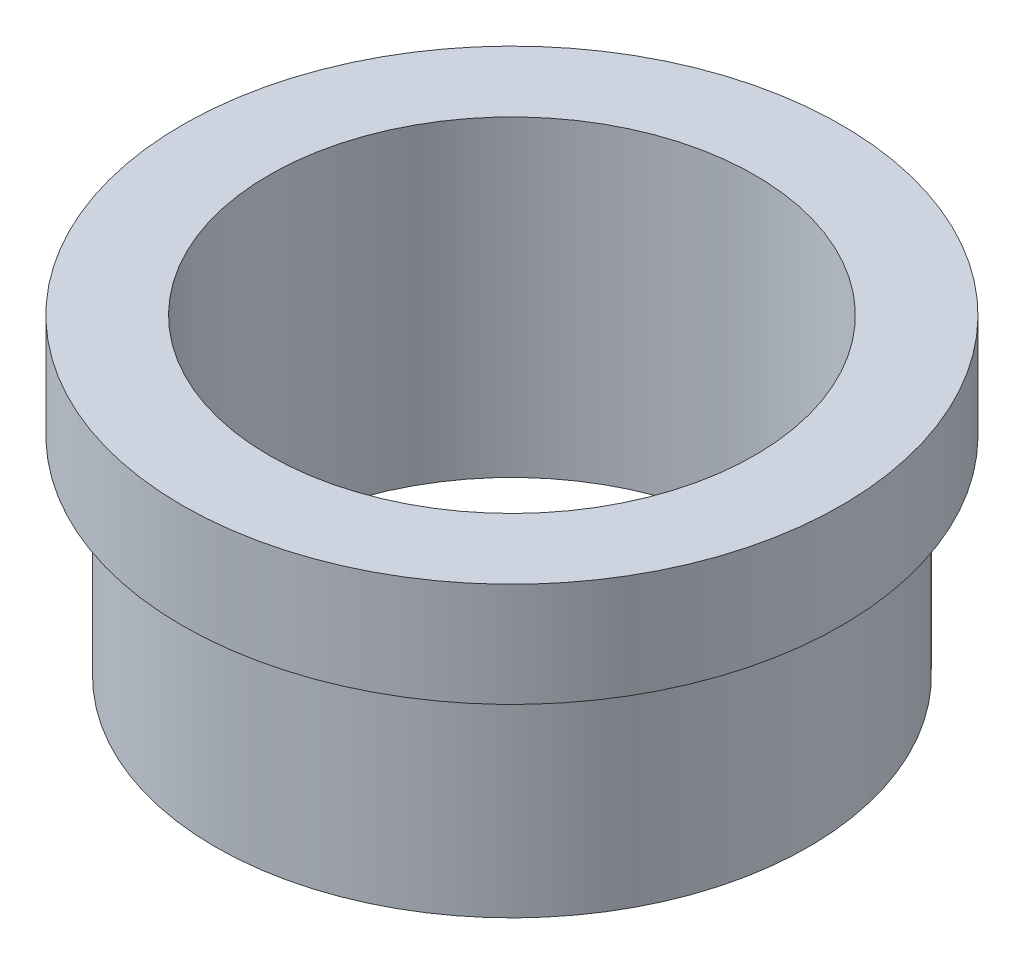
ISO-10303-21;
HEADER;
FILE_DESCRIPTION(('STEP AP214'),'2;1');
FILE_NAME('part.step','',(''),(''),'','','');
FILE_SCHEMA(('AUTOMOTIVE_DESIGN { 1 0 10303 214 1 1 1 1 }'));
ENDSEC;
DATA;
#1=APPLICATION_CONTEXT('core data for automotive mechanical design processes');
#2=APPLICATION_PROTOCOL_DEFINITION('international standard','automotive_design',2000,#1);
#3=PRODUCT_CONTEXT('',#1,'mechanical');
#4=PRODUCT('Part','Part','',(#3));
#5=PRODUCT_RELATED_PRODUCT_CATEGORY('part','',(#4));
#6=PRODUCT_DEFINITION_FORMATION('','',#4);
#7=PRODUCT_DEFINITION_CONTEXT('part definition',#1,'design');
#8=PRODUCT_DEFINITION('design','',#6,#7);
#9=PRODUCT_DEFINITION_SHAPE('','',#8);
#10=(LENGTH_UNIT() NAMED_UNIT(*) SI_UNIT(.MILLI.,.METRE.));
#11=(NAMED_UNIT(*) PLANE_ANGLE_UNIT() SI_UNIT($,.RADIAN.));
#12=(NAMED_UNIT(*) SI_UNIT($,.STERADIAN.) SOLID_ANGLE_UNIT());
#13=UNCERTAINTY_MEASURE_WITH_UNIT(LENGTH_MEASURE(1.E-05),#10,'distance_accuracy_value','');
#14=(GEOMETRIC_REPRESENTATION_CONTEXT(3) GLOBAL_UNCERTAINTY_ASSIGNED_CONTEXT((#13)) GLOBAL_UNIT_ASSIGNED_CONTEXT((#10,
#11,#12)) REPRESENTATION_CONTEXT('',''));
#15=CARTESIAN_POINT('',(0.,0.,0.));
#16=DIRECTION('',(0.,0.,1.));
#17=DIRECTION('',(1.,0.,0.));
#18=AXIS2_PLACEMENT_3D('',#15,#16,#17);
#19=CARTESIAN_POINT('',(0.,0.,0.));
#20=DIRECTION('',(0.,1.,0.));
#21=DIRECTION('',(0.,0.,1.));
#22=AXIS2_PLACEMENT_3D('',#19,#20,#21);
#23=PLANE('',#22);
#24=CARTESIAN_POINT('',(0.,0.,0.));
#25=DIRECTION('',(0.,1.,0.));
#26=DIRECTION('',(0.,0.,1.));
#27=AXIS2_PLACEMENT_3D('',#24,#25,#26);
#28=CIRCLE('',#27,8.55);
#29=CARTESIAN_POINT('',(0.,0.,8.55));
#30=VERTEX_POINT('',#29);
#31=EDGE_CURVE('E45',#30,#30,#28,.T.);
#32=ORIENTED_EDGE('',*,*,#31,.F.);
#33=EDGE_LOOP('',(#32));
#34=FACE_BOUND('',#33,.T.);
#35=CARTESIAN_POINT('',(0.,0.,0.));
#36=DIRECTION('',(0.,1.,0.));
#37=DIRECTION('',(0.,0.,1.));
#38=AXIS2_PLACEMENT_3D('',#35,#36,#37);
#39=CIRCLE('',#38,7.);
#40=CARTESIAN_POINT('',(0.,0.,7.));
#41=VERTEX_POINT('',#40);
#42=EDGE_CURVE('E52',#41,#41,#39,.T.);
#43=ORIENTED_EDGE('',*,*,#42,.T.);
#44=EDGE_LOOP('',(#43));
#45=FACE_BOUND('',#44,.T.);
#46=ADVANCED_FACE('F41',(#34,#45),#23,.F.);
#47=CARTESIAN_POINT('',(0.,6.,0.));
#48=DIRECTION('',(0.,-1.,0.));
#49=DIRECTION('',(0.,0.,-1.));
#50=AXIS2_PLACEMENT_3D('',#47,#48,#49);
#51=CYLINDRICAL_SURFACE('',#50,8.55);
#52=CARTESIAN_POINT('',(0.,6.,0.));
#53=DIRECTION('',(0.,1.,0.));
#54=DIRECTION('',(0.,0.,1.));
#55=AXIS2_PLACEMENT_3D('',#52,#53,#54);
#56=CIRCLE('',#55,8.55);
#57=CARTESIAN_POINT('',(0.,6.,8.55));
#58=VERTEX_POINT('',#57);
#59=EDGE_CURVE('E10',#58,#58,#56,.T.);
#60=ORIENTED_EDGE('',*,*,#59,.F.);
#61=EDGE_LOOP('',(#60));
#62=FACE_BOUND('',#61,.T.);
#63=ORIENTED_EDGE('',*,*,#31,.T.);
#64=EDGE_LOOP('',(#63));
#65=FACE_BOUND('',#64,.T.);
#66=ADVANCED_FACE('F43',(#62,#65),#51,.T.);
#67=CARTESIAN_POINT('',(0.,6.,0.));
#68=DIRECTION('',(0.,-1.,0.));
#69=DIRECTION('',(0.,0.,-1.));
#70=AXIS2_PLACEMENT_3D('',#67,#68,#69);
#71=CYLINDRICAL_SURFACE('',#70,7.);
#72=ORIENTED_EDGE('',*,*,#42,.F.);
#73=EDGE_LOOP('',(#72));
#74=FACE_BOUND('',#73,.T.);
#75=CARTESIAN_POINT('',(0.,9.,0.));
#76=DIRECTION('',(0.,1.,0.));
#77=DIRECTION('',(0.,0.,1.));
#78=AXIS2_PLACEMENT_3D('',#75,#76,#77);
#79=CIRCLE('',#78,7.);
#80=CARTESIAN_POINT('',(0.,9.,7.));
#81=VERTEX_POINT('',#80);
#82=EDGE_CURVE('E60',#81,#81,#79,.T.);
#83=ORIENTED_EDGE('',*,*,#82,.T.);
#84=EDGE_LOOP('',(#83));
#85=FACE_BOUND('',#84,.T.);
#86=ADVANCED_FACE('F66',(#74,#85),#71,.F.);
#87=CARTESIAN_POINT('',(0.,9.,0.));
#88=DIRECTION('',(0.,1.,0.));
#89=DIRECTION('',(0.,0.,1.));
#90=AXIS2_PLACEMENT_3D('',#87,#88,#89);
#91=PLANE('',#90);
#92=CARTESIAN_POINT('',(0.,9.,0.));
#93=DIRECTION('',(0.,1.,0.));
#94=DIRECTION('',(0.,0.,1.));
#95=AXIS2_PLACEMENT_3D('',#92,#93,#94);
#96=CIRCLE('',#95,9.5);
#97=CARTESIAN_POINT('',(0.,9.,9.5));
#98=VERTEX_POINT('',#97);
#99=EDGE_CURVE('E56',#98,#98,#96,.T.);
#100=ORIENTED_EDGE('',*,*,#99,.T.);
#101=EDGE_LOOP('',(#100));
#102=FACE_BOUND('',#101,.T.);
#103=ORIENTED_EDGE('',*,*,#82,.F.);
#104=EDGE_LOOP('',(#103));
#105=FACE_BOUND('',#104,.T.);
#106=ADVANCED_FACE('F68',(#102,#105),#91,.T.);
#107=CARTESIAN_POINT('',(0.,6.,0.));
#108=DIRECTION('',(0.,1.,0.));
#109=DIRECTION('',(0.,0.,1.));
#110=AXIS2_PLACEMENT_3D('',#107,#108,#109);
#111=PLANE('',#110);
#112=ORIENTED_EDGE('',*,*,#59,.T.);
#113=EDGE_LOOP('',(#112));
#114=FACE_BOUND('',#113,.T.);
#115=CARTESIAN_POINT('',(0.,6.,0.));
#116=DIRECTION('',(0.,1.,0.));
#117=DIRECTION('',(0.,0.,1.));
#118=AXIS2_PLACEMENT_3D('',#115,#116,#117);
#119=CIRCLE('',#118,9.5);
#120=CARTESIAN_POINT('',(0.,6.,9.5));
#121=VERTEX_POINT('',#120);
#122=EDGE_CURVE('E57',#121,#121,#119,.T.);
#123=ORIENTED_EDGE('',*,*,#122,.F.);
#124=EDGE_LOOP('',(#123));
#125=FACE_BOUND('',#124,.T.);
#126=ADVANCED_FACE('F70',(#114,#125),#111,.F.);
#127=CARTESIAN_POINT('',(0.,9.,0.));
#128=DIRECTION('',(0.,-1.,0.));
#129=DIRECTION('',(0.,0.,-1.));
#130=AXIS2_PLACEMENT_3D('',#127,#128,#129);
#131=CYLINDRICAL_SURFACE('',#130,9.5);
#132=ORIENTED_EDGE('',*,*,#99,.F.);
#133=EDGE_LOOP('',(#132));
#134=FACE_BOUND('',#133,.T.);
#135=ORIENTED_EDGE('',*,*,#122,.T.);
#136=EDGE_LOOP('',(#135));
#137=FACE_BOUND('',#136,.T.);
#138=ADVANCED_FACE('F77',(#134,#137),#131,.T.);
#139=CLOSED_SHELL('',(#46,#66,#86,#106,#126,#138));
#140=MANIFOLD_SOLID_BREP('B2',#139);
#141=ADVANCED_BREP_SHAPE_REPRESENTATION('',(#18,#140),#14);
#142=SHAPE_DEFINITION_REPRESENTATION(#9,#141);
ENDSEC;
END-ISO-10303-21;
